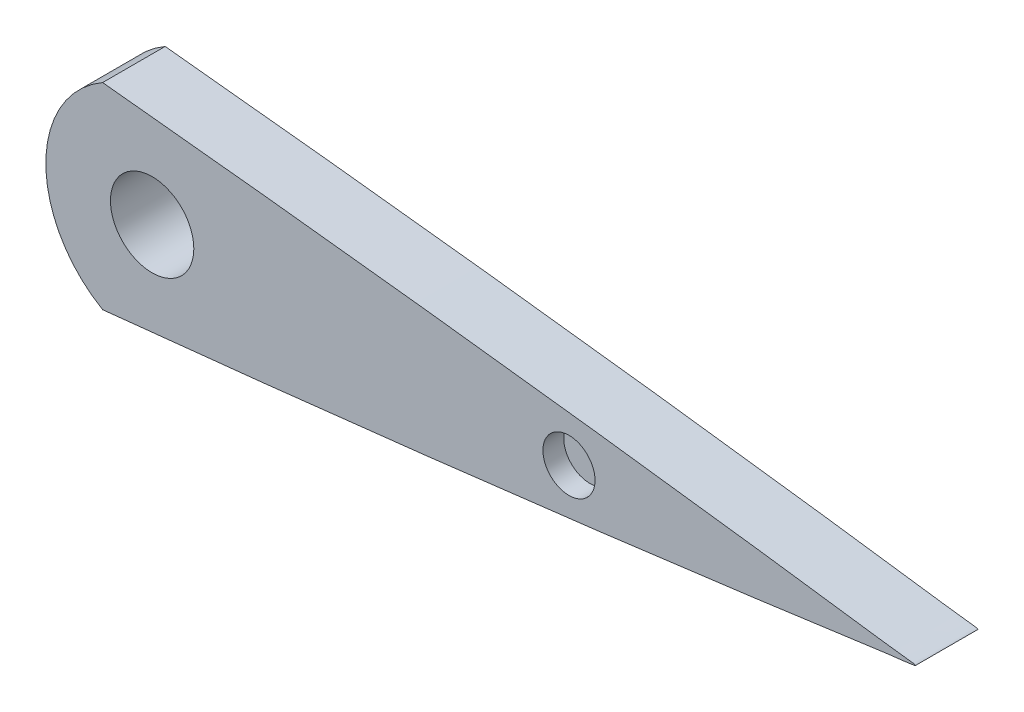
ISO-10303-21;
HEADER;
FILE_DESCRIPTION(('STEP AP214'),'2;1');
FILE_NAME('part.step','',(''),(''),'','','');
FILE_SCHEMA(('AUTOMOTIVE_DESIGN { 1 0 10303 214 1 1 1 1 }'));
ENDSEC;
DATA;
#1=APPLICATION_CONTEXT('core data for automotive mechanical design processes');
#2=APPLICATION_PROTOCOL_DEFINITION('international standard','automotive_design',2000,#1);
#3=PRODUCT_CONTEXT('',#1,'mechanical');
#4=PRODUCT('Part','Part','',(#3));
#5=PRODUCT_RELATED_PRODUCT_CATEGORY('part','',(#4));
#6=PRODUCT_DEFINITION_FORMATION('','',#4);
#7=PRODUCT_DEFINITION_CONTEXT('part definition',#1,'design');
#8=PRODUCT_DEFINITION('design','',#6,#7);
#9=PRODUCT_DEFINITION_SHAPE('','',#8);
#10=(LENGTH_UNIT() NAMED_UNIT(*) SI_UNIT(.MILLI.,.METRE.));
#11=(NAMED_UNIT(*) PLANE_ANGLE_UNIT() SI_UNIT($,.RADIAN.));
#12=(NAMED_UNIT(*) SI_UNIT($,.STERADIAN.) SOLID_ANGLE_UNIT());
#13=UNCERTAINTY_MEASURE_WITH_UNIT(LENGTH_MEASURE(1.E-05),#10,'distance_accuracy_value','');
#14=(GEOMETRIC_REPRESENTATION_CONTEXT(3) GLOBAL_UNCERTAINTY_ASSIGNED_CONTEXT((#13)) GLOBAL_UNIT_ASSIGNED_CONTEXT((#10,
#11,#12)) REPRESENTATION_CONTEXT('',''));
#15=CARTESIAN_POINT('',(0.,0.,0.));
#16=DIRECTION('',(0.,0.,1.));
#17=DIRECTION('',(1.,0.,0.));
#18=AXIS2_PLACEMENT_3D('',#15,#16,#17);
#19=CARTESIAN_POINT('',(215.04981094645,0.,6.));
#20=DIRECTION('',(0.,0.,-1.));
#21=DIRECTION('',(-1.,0.,0.));
#22=AXIS2_PLACEMENT_3D('',#19,#20,#21);
#23=CYLINDRICAL_SURFACE('',#22,10.8996218929007);
#24=CARTESIAN_POINT('',(215.04981094645,0.,0.));
#25=DIRECTION('',(0.,0.,1.));
#26=DIRECTION('',(1.,0.,0.));
#27=AXIS2_PLACEMENT_3D('',#24,#25,#26);
#28=CIRCLE('',#27,10.8996218929007);
#29=CARTESIAN_POINT('',(209.6,9.43934945089707,0.));
#30=VERTEX_POINT('',#29);
#31=CARTESIAN_POINT('',(209.6,-9.43934945089705,0.));
#32=VERTEX_POINT('',#31);
#33=EDGE_CURVE('E67',#30,#32,#28,.T.);
#34=ORIENTED_EDGE('',*,*,#33,.T.);
#35=DIRECTION('',(0.,0.,-1.));
#36=VECTOR('',#35,1.);
#37=CARTESIAN_POINT('',(209.6,-9.43934945089705,6.));
#38=LINE('',#37,#36);
#39=CARTESIAN_POINT('',(209.6,-9.43934945089705,6.));
#40=VERTEX_POINT('',#39);
#41=EDGE_CURVE('E11',#40,#32,#38,.T.);
#42=ORIENTED_EDGE('',*,*,#41,.F.);
#43=CARTESIAN_POINT('',(215.04981094645,0.,6.));
#44=DIRECTION('',(0.,0.,1.));
#45=DIRECTION('',(1.,0.,0.));
#46=AXIS2_PLACEMENT_3D('',#43,#44,#45);
#47=CIRCLE('',#46,10.8996218929007);
#48=CARTESIAN_POINT('',(209.6,9.43934945089707,6.));
#49=VERTEX_POINT('',#48);
#50=EDGE_CURVE('E70',#49,#40,#47,.T.);
#51=ORIENTED_EDGE('',*,*,#50,.F.);
#52=DIRECTION('',(0.,0.,-1.));
#53=VECTOR('',#52,1.);
#54=CARTESIAN_POINT('',(209.6,9.43934945089707,6.));
#55=LINE('',#54,#53);
#56=EDGE_CURVE('E44',#49,#30,#55,.T.);
#57=ORIENTED_EDGE('',*,*,#56,.T.);
#58=EDGE_LOOP('',(#34,#42,#51,#57));
#59=FACE_BOUND('',#58,.T.);
#60=ADVANCED_FACE('F35',(#59),#23,.T.);
#61=CARTESIAN_POINT('',(0.,0.,0.));
#62=DIRECTION('',(0.,0.,1.));
#63=DIRECTION('',(1.,0.,0.));
#64=AXIS2_PLACEMENT_3D('',#61,#62,#63);
#65=PLANE('',#64);
#66=CARTESIAN_POINT('',(214.35,0.,0.));
#67=DIRECTION('',(0.,0.,1.));
#68=DIRECTION('',(1.,0.,0.));
#69=AXIS2_PLACEMENT_3D('',#66,#67,#68);
#70=CIRCLE('',#69,3.99999999999999);
#71=CARTESIAN_POINT('',(218.35,0.,0.));
#72=VERTEX_POINT('',#71);
#73=EDGE_CURVE('E72',#72,#72,#70,.T.);
#74=ORIENTED_EDGE('',*,*,#73,.T.);
#75=EDGE_LOOP('',(#74));
#76=FACE_BOUND('',#75,.T.);
#77=ORIENTED_EDGE('',*,*,#33,.F.);
#78=CARTESIAN_POINT('',(287.6,0.,0.));
#79=CARTESIAN_POINT('',(287.6,0.119697914014841,0.));
#80=CARTESIAN_POINT('',(285.817754552664,0.247185692220203,0.));
#81=CARTESIAN_POINT('',(284.767865992233,0.398094711084379,0.));
#82=CARTESIAN_POINT('',(284.264448894358,0.467820008586102,0.));
#83=CARTESIAN_POINT('',(283.437688129909,0.583773245146681,0.));
#84=CARTESIAN_POINT('',(282.277829484838,0.745074060379501,0.));
#85=CARTESIAN_POINT('',(280.793202235579,0.949881536370258,0.));
#86=CARTESIAN_POINT('',(278.985101469763,1.1984502666094,0.));
#87=CARTESIAN_POINT('',(276.858420544221,1.48809192562316,0.));
#88=CARTESIAN_POINT('',(274.417893216763,1.81693038055174,0.));
#89=CARTESIAN_POINT('',(271.66940199949,2.18355958445684,0.));
#90=CARTESIAN_POINT('',(268.619301695558,2.58534723696543,0.));
#91=CARTESIAN_POINT('',(265.274709703673,3.02040609503913,0.));
#92=CARTESIAN_POINT('',(261.643364864608,3.48524395507677,0.));
#93=CARTESIAN_POINT('',(257.733807870872,3.97868529019274,0.));
#94=CARTESIAN_POINT('',(253.555140370569,4.49727783038827,0.));
#95=CARTESIAN_POINT('',(249.117159968939,5.03833936487388,0.));
#96=CARTESIAN_POINT('',(244.430264247496,5.59945473584973,0.));
#97=CARTESIAN_POINT('',(239.505368100464,6.177691952735,0.));
#98=CARTESIAN_POINT('',(234.353792880747,6.76958711877471,0.));
#99=CARTESIAN_POINT('',(228.987863488273,7.37362863835451,0.));
#100=CARTESIAN_POINT('',(223.419943836905,7.98548338443785,0.));
#101=CARTESIAN_POINT('',(217.663214550996,8.6035080668215,0.));
#102=CARTESIAN_POINT('',(211.730895239435,9.2232861411125,0.));
#103=CARTESIAN_POINT('',(205.636969584255,9.84366910331874,0.));
#104=CARTESIAN_POINT('',(199.395595320274,10.45987310798,0.));
#105=CARTESIAN_POINT('',(193.021447659429,11.069962817779,0.));
#106=CARTESIAN_POINT('',(186.529328524621,11.6697008746456,0.));
#107=CARTESIAN_POINT('',(179.934382420697,12.2571265394771,0.));
#108=CARTESIAN_POINT('',(173.252052511447,12.8273836050006,0.));
#109=CARTESIAN_POINT('',(166.497911298237,13.3779214288825,0.));
#110=CARTESIAN_POINT('',(159.687818768774,13.9052241538978,0.));
#111=CARTESIAN_POINT('',(152.837593287382,14.4050588321949,0.));
#112=CARTESIAN_POINT('',(145.963333172088,14.8742906122945,0.));
#113=CARTESIAN_POINT('',(139.081085421989,15.3091712857545,0.));
#114=CARTESIAN_POINT('',(132.206780290406,15.7055009599027,0.));
#115=CARTESIAN_POINT('',(125.356600440192,16.0601454359753,0.));
#116=CARTESIAN_POINT('',(118.546388357296,16.3692329997914,0.));
#117=CARTESIAN_POINT('',(111.792105264837,16.629320446272,0.));
#118=CARTESIAN_POINT('',(105.109627009694,16.837520337437,0.));
#119=CARTESIAN_POINT('',(98.514511854997,16.9901292177328,0.));
#120=CARTESIAN_POINT('',(92.0221565970091,17.0844567684101,0.));
#121=CARTESIAN_POINT('',(85.6475664190688,17.1178517461476,0.));
#122=CARTESIAN_POINT('',(79.4057544711064,17.0883297738282,0.));
#123=CARTESIAN_POINT('',(73.3113289392046,16.9945635357831,0.));
#124=CARTESIAN_POINT('',(67.3785710157447,16.8337193151445,0.));
#125=CARTESIAN_POINT('',(61.6212046695942,16.6065088817885,0.));
#126=CARTESIAN_POINT('',(56.0526639568473,16.3112996890211,0.));
#127=CARTESIAN_POINT('',(50.6859131508304,15.9489191467969,0.));
#128=CARTESIAN_POINT('',(45.5335897343173,15.5194428091914,0.));
#129=CARTESIAN_POINT('',(40.607672549961,15.0236512800114,0.));
#130=CARTESIAN_POINT('',(35.9196071306174,14.4634253189774,0.));
#131=CARTESIAN_POINT('',(31.4802012991654,13.8410420830018,0.));
#132=CARTESIAN_POINT('',(27.2999132394191,13.1576617434693,0.));
#133=CARTESIAN_POINT('',(23.3883233748371,12.4166997464567,0.));
#134=CARTESIAN_POINT('',(19.7544341778053,11.6209421860295,0.));
#135=CARTESIAN_POINT('',(16.4067383300376,10.7730866418769,0.));
#136=CARTESIAN_POINT('',(13.3526332085872,9.87693133405896,0.));
#137=CARTESIAN_POINT('',(10.5988531034695,8.93545239752696,0.));
#138=CARTESIAN_POINT('',(8.15127060236487,7.95190150330027,0.));
#139=CARTESIAN_POINT('',(6.01473080478667,6.92911600148182,0.));
#140=CARTESIAN_POINT('',(4.1933041001361,5.86922528338378,0.));
#141=CARTESIAN_POINT('',(2.68911146322606,4.77402607186209,0.));
#142=CARTESIAN_POINT('',(1.5050594014883,3.64171682748772,0.));
#143=CARTESIAN_POINT('',(0.644003291289437,2.46908990410035,0.));
#144=CARTESIAN_POINT('',(0.117552225010534,1.25041364148594,0.));
#145=CARTESIAN_POINT('',(-0.0572998766529997,0.,0.));
#146=CARTESIAN_POINT('',(0.117552225010506,-1.25041364148582,0.));
#147=CARTESIAN_POINT('',(0.644003291289472,-2.46908990410043,0.));
#148=CARTESIAN_POINT('',(1.50505940148827,-3.64171682748767,0.));
#149=CARTESIAN_POINT('',(2.68911146322611,-4.77402607186214,0.));
#150=CARTESIAN_POINT('',(4.19330410013606,-5.86922528338374,0.));
#151=CARTESIAN_POINT('',(6.01473080478668,-6.92911600148183,0.));
#152=CARTESIAN_POINT('',(8.15127060236485,-7.95190150330026,0.));
#153=CARTESIAN_POINT('',(10.5988531034695,-8.93545239752697,0.));
#154=CARTESIAN_POINT('',(13.3526332085872,-9.87693133405896,0.));
#155=CARTESIAN_POINT('',(16.4067383300376,-10.7730866418769,0.));
#156=CARTESIAN_POINT('',(19.7544341778053,-11.6209421860295,0.));
#157=CARTESIAN_POINT('',(23.3883233748371,-12.4166997464567,0.));
#158=CARTESIAN_POINT('',(27.2999132394191,-13.1576617434693,0.));
#159=CARTESIAN_POINT('',(31.4802012991654,-13.8410420830018,0.));
#160=CARTESIAN_POINT('',(35.9196071306174,-14.4634253189774,0.));
#161=CARTESIAN_POINT('',(40.607672549961,-15.0236512800114,0.));
#162=CARTESIAN_POINT('',(45.5335897343173,-15.5194428091914,0.));
#163=CARTESIAN_POINT('',(50.6859131508304,-15.9489191467969,0.));
#164=CARTESIAN_POINT('',(56.0526639568472,-16.3112996890211,0.));
#165=CARTESIAN_POINT('',(61.6212046695943,-16.6065088817886,0.));
#166=CARTESIAN_POINT('',(67.3785710157446,-16.8337193151445,0.));
#167=CARTESIAN_POINT('',(73.3113289392046,-16.9945635357831,0.));
#168=CARTESIAN_POINT('',(79.4057544711064,-17.0883297738282,0.));
#169=CARTESIAN_POINT('',(85.6475664190687,-17.1178517461476,0.));
#170=CARTESIAN_POINT('',(92.0221565970092,-17.0844567684101,0.));
#171=CARTESIAN_POINT('',(98.5145118549969,-16.9901292177328,0.));
#172=CARTESIAN_POINT('',(105.109627009694,-16.837520337437,0.));
#173=CARTESIAN_POINT('',(111.792105264837,-16.629320446272,0.));
#174=CARTESIAN_POINT('',(118.546388357296,-16.3692329997914,0.));
#175=CARTESIAN_POINT('',(125.356600440192,-16.0601454359753,0.));
#176=CARTESIAN_POINT('',(132.206780290406,-15.7055009599027,0.));
#177=CARTESIAN_POINT('',(139.081085421989,-15.3091712857545,0.));
#178=CARTESIAN_POINT('',(145.963333172087,-14.8742906122945,0.));
#179=CARTESIAN_POINT('',(152.837593287382,-14.4050588321949,0.));
#180=CARTESIAN_POINT('',(159.687818768774,-13.9052241538978,0.));
#181=CARTESIAN_POINT('',(166.497911298237,-13.3779214288825,0.));
#182=CARTESIAN_POINT('',(173.252052511447,-12.8273836050006,0.));
#183=CARTESIAN_POINT('',(179.934382420697,-12.2571265394771,0.));
#184=CARTESIAN_POINT('',(186.529328524621,-11.6697008746456,0.));
#185=CARTESIAN_POINT('',(193.021447659429,-11.069962817779,0.));
#186=CARTESIAN_POINT('',(199.395595320274,-10.4598731079799,0.));
#187=CARTESIAN_POINT('',(205.636969584255,-9.84366910331874,0.));
#188=CARTESIAN_POINT('',(211.730895239435,-9.2232861411125,0.));
#189=CARTESIAN_POINT('',(217.663214550996,-8.6035080668215,0.));
#190=CARTESIAN_POINT('',(223.419943836904,-7.98548338443785,0.));
#191=CARTESIAN_POINT('',(228.987863488273,-7.37362863835451,0.));
#192=CARTESIAN_POINT('',(234.353792880747,-6.76958711877471,0.));
#193=CARTESIAN_POINT('',(239.505368100465,-6.177691952735,0.));
#194=CARTESIAN_POINT('',(244.430264247496,-5.59945473584973,0.));
#195=CARTESIAN_POINT('',(249.117159968939,-5.03833936487388,0.));
#196=CARTESIAN_POINT('',(253.555140370569,-4.49727783038826,0.));
#197=CARTESIAN_POINT('',(257.733807870872,-3.97868529019274,0.));
#198=CARTESIAN_POINT('',(261.643364864608,-3.48524395507677,0.));
#199=CARTESIAN_POINT('',(265.274709703674,-3.02040609503912,0.));
#200=CARTESIAN_POINT('',(268.619301695558,-2.58534723696544,0.));
#201=CARTESIAN_POINT('',(271.66940199949,-2.18355958445684,0.));
#202=CARTESIAN_POINT('',(274.417893216763,-1.81693038055173,0.));
#203=CARTESIAN_POINT('',(276.858420544221,-1.48809192562316,0.));
#204=CARTESIAN_POINT('',(278.985101469763,-1.19845026660941,0.));
#205=CARTESIAN_POINT('',(280.793202235579,-0.949881536370248,0.));
#206=CARTESIAN_POINT('',(282.277829484838,-0.745074060379503,0.));
#207=CARTESIAN_POINT('',(283.437688129909,-0.583773245146693,0.));
#208=CARTESIAN_POINT('',(284.264448894358,-0.467820008586088,0.));
#209=CARTESIAN_POINT('',(284.767865992233,-0.398094711084389,0.));
#210=CARTESIAN_POINT('',(285.817754552664,-0.24718569222016,0.));
#211=CARTESIAN_POINT('',(287.6,-0.119697914014841,0.));
#212=CARTESIAN_POINT('',(287.6,0.,0.));
#213=B_SPLINE_CURVE_WITH_KNOTS('',3,(#78,#79,#80,#81,#82,#83,#84,#85,#86,#87,#88,#89,#90,#91,
#92,#93,#94,#95,#96,#97,#98,#99,#100,#101,#102,#103,#104,#105,#106,#107,#108,#109,#110,#111,
#112,#113,#114,#115,#116,#117,#118,#119,#120,#121,#122,#123,#124,#125,#126,#127,#128,#129,#130,
#131,#132,#133,#134,#135,#136,#137,#138,#139,#140,#141,#142,#143,#144,#145,#146,#147,#148,#149,
#150,#151,#152,#153,#154,#155,#156,#157,#158,#159,#160,#161,#162,#163,#164,#165,#166,#167,#168,
#169,#170,#171,#172,#173,#174,#175,#176,#177,#178,#179,#180,#181,#182,#183,#184,#185,#186,#187,
#188,#189,#190,#191,#192,#193,#194,#195,#196,#197,#198,#199,#200,#201,#202,#203,#204,#205,#206,
#207,#208,#209,#210,#211,#212),.UNSPECIFIED.,.T.,.F.,(4,1,1,1,1,1,1,1,1,1,1,1,1,1,1,1,1,1,1,1,1,
1,1,1,1,1,1,1,1,1,1,1,1,1,1,1,1,1,1,1,1,1,1,1,1,1,1,1,1,1,1,1,1,1,1,1,1,1,1,1,1,1,1,1,1,1,1,1,1,
1,1,1,1,1,1,1,1,1,1,1,1,1,1,1,1,1,1,1,1,1,1,1,1,1,1,1,1,1,1,1,1,1,1,1,1,1,1,1,1,1,1,1,1,1,1,1,1,
1,1,1,1,1,1,1,1,1,1,1,1,1,1,1,4),(0.,0.00440467874114974,0.00469133243498179,
0.00555026343079178,0.00697995997176306,0.00897636965828355,0.0115348259845733,
0.014649420054061,0.0183124680898201,0.0225153298008114,0.0272475070546298,0.0324978969838546,
0.0382539577522555,0.044502067222391,0.0512268693575091,0.0584133135935181,0.0660434674273018,
0.0740989842283932,0.0825619521117382,0.0914115186604247,0.100627009072821,0.110186574614935,
0.120067574865949,0.130246743077792,0.140700546583312,0.151404252252594,0.162331841984017,
0.173458675416978,0.184758289770567,0.19620407601809,0.207768617658098,0.21942594490095,
0.231147635091939,0.242906359386442,0.25467529642669,0.266426209726725,0.278132454883059,
0.289766476692586,0.301301813989679,0.312711645869573,0.323969258957322,0.335050049679421,
0.345928598530739,0.356580621255151,0.366981996115004,0.377109775977847,0.386942118770167,
0.396457905020584,0.405636644874136,0.414459070105715,0.422906620431116,0.430962851267296,
0.438611617871312,0.445838274987848,0.45263037682836,0.458976172588996,0.464866300146168,
0.470293867967317,0.475254828838946,0.479749124231831,0.483781005915864,0.487362579764443,
0.490515631725796,0.493278565847941,0.495712194392614,0.497909944006647,0.5,0.502090055993354,
0.504287805607387,0.50672143415206,0.509484368274205,0.512637420235557,0.516218994084137,
0.52025087576817,0.524745171161054,0.529706132032683,0.535133699853832,0.541023827411005,
0.54736962317164,0.554161725012152,0.561388382128688,0.569037148732705,0.577093379568885,
0.585540929894285,0.594363355125865,0.603542094979417,0.613057881229834,0.622890224022154,
0.633018003884997,0.64341937874485,0.654071401469262,0.66494995032058,0.676030741042678,
0.687288354130427,0.698698186010322,0.710233523307414,0.721867545116942,0.733573790273275,
0.74532470357331,0.757093640613558,0.768852364908061,0.780574055099051,0.792231382341903,
0.80379592398191,0.815241710229433,0.826541324583022,0.837668158015983,0.848595747747406,
0.859299453416688,0.869753256922208,0.879932425134051,0.889813425385066,0.89937299092718,
0.908588481339576,0.917438047888262,0.925901015771607,0.933956532572698,0.941586686406482,
0.948773130642491,0.955497932777609,0.961746042247745,0.967502103016146,0.972752492945371,
0.977484670199189,0.98168753191018,0.985350579945939,0.988465174015427,0.991023630341717,
0.993020040028237,0.994449736569208,0.995308667565018,0.99559532125885,1.),.UNSPECIFIED.);
#214=EDGE_CURVE('E59',#32,#30,#213,.T.);
#215=ORIENTED_EDGE('',*,*,#214,.F.);
#216=EDGE_LOOP('',(#77,#215));
#217=FACE_BOUND('',#216,.T.);
#218=ADVANCED_FACE('F71',(#76,#217),#65,.F.);
#219=CARTESIAN_POINT('',(287.6,0.,6.));
#220=CARTESIAN_POINT('',(287.6,0.119697914014841,6.));
#221=CARTESIAN_POINT('',(285.817754552664,0.247185692220203,6.));
#222=CARTESIAN_POINT('',(284.767865992233,0.398094711084379,6.));
#223=CARTESIAN_POINT('',(284.264448894358,0.467820008586102,6.));
#224=CARTESIAN_POINT('',(283.437688129909,0.583773245146681,6.));
#225=CARTESIAN_POINT('',(282.277829484838,0.745074060379501,6.));
#226=CARTESIAN_POINT('',(280.793202235579,0.949881536370258,6.));
#227=CARTESIAN_POINT('',(278.985101469763,1.1984502666094,6.));
#228=CARTESIAN_POINT('',(276.858420544221,1.48809192562316,6.));
#229=CARTESIAN_POINT('',(274.417893216763,1.81693038055174,6.));
#230=CARTESIAN_POINT('',(271.66940199949,2.18355958445684,6.));
#231=CARTESIAN_POINT('',(268.619301695558,2.58534723696543,6.));
#232=CARTESIAN_POINT('',(265.274709703673,3.02040609503913,6.));
#233=CARTESIAN_POINT('',(261.643364864608,3.48524395507677,6.));
#234=CARTESIAN_POINT('',(257.733807870872,3.97868529019274,6.));
#235=CARTESIAN_POINT('',(253.555140370569,4.49727783038827,6.));
#236=CARTESIAN_POINT('',(249.117159968939,5.03833936487388,6.));
#237=CARTESIAN_POINT('',(244.430264247496,5.59945473584973,6.));
#238=CARTESIAN_POINT('',(239.505368100464,6.177691952735,6.));
#239=CARTESIAN_POINT('',(234.353792880747,6.76958711877471,6.));
#240=CARTESIAN_POINT('',(228.987863488273,7.37362863835451,6.));
#241=CARTESIAN_POINT('',(223.419943836905,7.98548338443785,6.));
#242=CARTESIAN_POINT('',(217.663214550996,8.6035080668215,6.));
#243=CARTESIAN_POINT('',(211.730895239435,9.2232861411125,6.));
#244=CARTESIAN_POINT('',(205.636969584255,9.84366910331874,6.));
#245=CARTESIAN_POINT('',(199.395595320274,10.45987310798,6.));
#246=CARTESIAN_POINT('',(193.021447659429,11.069962817779,6.));
#247=CARTESIAN_POINT('',(186.529328524621,11.6697008746456,6.));
#248=CARTESIAN_POINT('',(179.934382420697,12.2571265394771,6.));
#249=CARTESIAN_POINT('',(173.252052511447,12.8273836050006,6.));
#250=CARTESIAN_POINT('',(166.497911298237,13.3779214288825,6.));
#251=CARTESIAN_POINT('',(159.687818768774,13.9052241538978,6.));
#252=CARTESIAN_POINT('',(152.837593287382,14.4050588321949,6.));
#253=CARTESIAN_POINT('',(145.963333172088,14.8742906122945,6.));
#254=CARTESIAN_POINT('',(139.081085421989,15.3091712857545,6.));
#255=CARTESIAN_POINT('',(132.206780290406,15.7055009599027,6.));
#256=CARTESIAN_POINT('',(125.356600440192,16.0601454359753,6.));
#257=CARTESIAN_POINT('',(118.546388357296,16.3692329997914,6.));
#258=CARTESIAN_POINT('',(111.792105264837,16.629320446272,6.));
#259=CARTESIAN_POINT('',(105.109627009694,16.837520337437,6.));
#260=CARTESIAN_POINT('',(98.514511854997,16.9901292177328,6.));
#261=CARTESIAN_POINT('',(92.0221565970091,17.0844567684101,6.));
#262=CARTESIAN_POINT('',(85.6475664190688,17.1178517461476,6.));
#263=CARTESIAN_POINT('',(79.4057544711064,17.0883297738282,6.));
#264=CARTESIAN_POINT('',(73.3113289392046,16.9945635357831,6.));
#265=CARTESIAN_POINT('',(67.3785710157447,16.8337193151445,6.));
#266=CARTESIAN_POINT('',(61.6212046695942,16.6065088817885,6.));
#267=CARTESIAN_POINT('',(56.0526639568473,16.3112996890211,6.));
#268=CARTESIAN_POINT('',(50.6859131508304,15.9489191467969,6.));
#269=CARTESIAN_POINT('',(45.5335897343173,15.5194428091914,6.));
#270=CARTESIAN_POINT('',(40.607672549961,15.0236512800114,6.));
#271=CARTESIAN_POINT('',(35.9196071306174,14.4634253189774,6.));
#272=CARTESIAN_POINT('',(31.4802012991654,13.8410420830018,6.));
#273=CARTESIAN_POINT('',(27.2999132394191,13.1576617434693,6.));
#274=CARTESIAN_POINT('',(23.3883233748371,12.4166997464567,6.));
#275=CARTESIAN_POINT('',(19.7544341778053,11.6209421860295,6.));
#276=CARTESIAN_POINT('',(16.4067383300376,10.7730866418769,6.));
#277=CARTESIAN_POINT('',(13.3526332085872,9.87693133405896,6.));
#278=CARTESIAN_POINT('',(10.5988531034695,8.93545239752696,6.));
#279=CARTESIAN_POINT('',(8.15127060236487,7.95190150330027,6.));
#280=CARTESIAN_POINT('',(6.01473080478667,6.92911600148182,6.));
#281=CARTESIAN_POINT('',(4.1933041001361,5.86922528338378,6.));
#282=CARTESIAN_POINT('',(2.68911146322606,4.77402607186209,6.));
#283=CARTESIAN_POINT('',(1.5050594014883,3.64171682748772,6.));
#284=CARTESIAN_POINT('',(0.644003291289437,2.46908990410035,6.));
#285=CARTESIAN_POINT('',(0.117552225010534,1.25041364148594,6.));
#286=CARTESIAN_POINT('',(-0.0572998766529997,0.,6.));
#287=CARTESIAN_POINT('',(0.117552225010506,-1.25041364148582,6.));
#288=CARTESIAN_POINT('',(0.644003291289472,-2.46908990410043,6.));
#289=CARTESIAN_POINT('',(1.50505940148827,-3.64171682748767,6.));
#290=CARTESIAN_POINT('',(2.68911146322611,-4.77402607186214,6.));
#291=CARTESIAN_POINT('',(4.19330410013606,-5.86922528338374,6.));
#292=CARTESIAN_POINT('',(6.01473080478668,-6.92911600148183,6.));
#293=CARTESIAN_POINT('',(8.15127060236485,-7.95190150330026,6.));
#294=CARTESIAN_POINT('',(10.5988531034695,-8.93545239752697,6.));
#295=CARTESIAN_POINT('',(13.3526332085872,-9.87693133405896,6.));
#296=CARTESIAN_POINT('',(16.4067383300376,-10.7730866418769,6.));
#297=CARTESIAN_POINT('',(19.7544341778053,-11.6209421860295,6.));
#298=CARTESIAN_POINT('',(23.3883233748371,-12.4166997464567,6.));
#299=CARTESIAN_POINT('',(27.2999132394191,-13.1576617434693,6.));
#300=CARTESIAN_POINT('',(31.4802012991654,-13.8410420830018,6.));
#301=CARTESIAN_POINT('',(35.9196071306174,-14.4634253189774,6.));
#302=CARTESIAN_POINT('',(40.607672549961,-15.0236512800114,6.));
#303=CARTESIAN_POINT('',(45.5335897343173,-15.5194428091914,6.));
#304=CARTESIAN_POINT('',(50.6859131508304,-15.9489191467969,6.));
#305=CARTESIAN_POINT('',(56.0526639568472,-16.3112996890211,6.));
#306=CARTESIAN_POINT('',(61.6212046695943,-16.6065088817886,6.));
#307=CARTESIAN_POINT('',(67.3785710157446,-16.8337193151445,6.));
#308=CARTESIAN_POINT('',(73.3113289392046,-16.9945635357831,6.));
#309=CARTESIAN_POINT('',(79.4057544711064,-17.0883297738282,6.));
#310=CARTESIAN_POINT('',(85.6475664190687,-17.1178517461476,6.));
#311=CARTESIAN_POINT('',(92.0221565970092,-17.0844567684101,6.));
#312=CARTESIAN_POINT('',(98.5145118549969,-16.9901292177328,6.));
#313=CARTESIAN_POINT('',(105.109627009694,-16.837520337437,6.));
#314=CARTESIAN_POINT('',(111.792105264837,-16.629320446272,6.));
#315=CARTESIAN_POINT('',(118.546388357296,-16.3692329997914,6.));
#316=CARTESIAN_POINT('',(125.356600440192,-16.0601454359753,6.));
#317=CARTESIAN_POINT('',(132.206780290406,-15.7055009599027,6.));
#318=CARTESIAN_POINT('',(139.081085421989,-15.3091712857545,6.));
#319=CARTESIAN_POINT('',(145.963333172087,-14.8742906122945,6.));
#320=CARTESIAN_POINT('',(152.837593287382,-14.4050588321949,6.));
#321=CARTESIAN_POINT('',(159.687818768774,-13.9052241538978,6.));
#322=CARTESIAN_POINT('',(166.497911298237,-13.3779214288825,6.));
#323=CARTESIAN_POINT('',(173.252052511447,-12.8273836050006,6.));
#324=CARTESIAN_POINT('',(179.934382420697,-12.2571265394771,6.));
#325=CARTESIAN_POINT('',(186.529328524621,-11.6697008746456,6.));
#326=CARTESIAN_POINT('',(193.021447659429,-11.069962817779,6.));
#327=CARTESIAN_POINT('',(199.395595320274,-10.4598731079799,6.));
#328=CARTESIAN_POINT('',(205.636969584255,-9.84366910331874,6.));
#329=CARTESIAN_POINT('',(211.730895239435,-9.2232861411125,6.));
#330=CARTESIAN_POINT('',(217.663214550996,-8.6035080668215,6.));
#331=CARTESIAN_POINT('',(223.419943836904,-7.98548338443785,6.));
#332=CARTESIAN_POINT('',(228.987863488273,-7.37362863835451,6.));
#333=CARTESIAN_POINT('',(234.353792880747,-6.76958711877471,6.));
#334=CARTESIAN_POINT('',(239.505368100465,-6.177691952735,6.));
#335=CARTESIAN_POINT('',(244.430264247496,-5.59945473584973,6.));
#336=CARTESIAN_POINT('',(249.117159968939,-5.03833936487388,6.));
#337=CARTESIAN_POINT('',(253.555140370569,-4.49727783038826,6.));
#338=CARTESIAN_POINT('',(257.733807870872,-3.97868529019274,6.));
#339=CARTESIAN_POINT('',(261.643364864608,-3.48524395507677,6.));
#340=CARTESIAN_POINT('',(265.274709703674,-3.02040609503912,6.));
#341=CARTESIAN_POINT('',(268.619301695558,-2.58534723696544,6.));
#342=CARTESIAN_POINT('',(271.66940199949,-2.18355958445684,6.));
#343=CARTESIAN_POINT('',(274.417893216763,-1.81693038055173,6.));
#344=CARTESIAN_POINT('',(276.858420544221,-1.48809192562316,6.));
#345=CARTESIAN_POINT('',(278.985101469763,-1.19845026660941,6.));
#346=CARTESIAN_POINT('',(280.793202235579,-0.949881536370248,6.));
#347=CARTESIAN_POINT('',(282.277829484838,-0.745074060379503,6.));
#348=CARTESIAN_POINT('',(283.437688129909,-0.583773245146693,6.));
#349=CARTESIAN_POINT('',(284.264448894358,-0.467820008586088,6.));
#350=CARTESIAN_POINT('',(284.767865992233,-0.398094711084389,6.));
#351=CARTESIAN_POINT('',(285.817754552664,-0.24718569222016,6.));
#352=CARTESIAN_POINT('',(287.6,-0.119697914014841,6.));
#353=CARTESIAN_POINT('',(287.6,0.,6.));
#354=B_SPLINE_CURVE_WITH_KNOTS('',3,(#219,#220,#221,#222,#223,#224,#225,#226,#227,#228,#229,
#230,#231,#232,#233,#234,#235,#236,#237,#238,#239,#240,#241,#242,#243,#244,#245,#246,#247,#248,
#249,#250,#251,#252,#253,#254,#255,#256,#257,#258,#259,#260,#261,#262,#263,#264,#265,#266,#267,
#268,#269,#270,#271,#272,#273,#274,#275,#276,#277,#278,#279,#280,#281,#282,#283,#284,#285,#286,
#287,#288,#289,#290,#291,#292,#293,#294,#295,#296,#297,#298,#299,#300,#301,#302,#303,#304,#305,
#306,#307,#308,#309,#310,#311,#312,#313,#314,#315,#316,#317,#318,#319,#320,#321,#322,#323,#324,
#325,#326,#327,#328,#329,#330,#331,#332,#333,#334,#335,#336,#337,#338,#339,#340,#341,#342,#343,
#344,#345,#346,#347,#348,#349,#350,#351,#352,#353),.UNSPECIFIED.,.T.,.F.,(4,1,1,1,1,1,1,1,1,1,1,
1,1,1,1,1,1,1,1,1,1,1,1,1,1,1,1,1,1,1,1,1,1,1,1,1,1,1,1,1,1,1,1,1,1,1,1,1,1,1,1,1,1,1,1,1,1,1,1,
1,1,1,1,1,1,1,1,1,1,1,1,1,1,1,1,1,1,1,1,1,1,1,1,1,1,1,1,1,1,1,1,1,1,1,1,1,1,1,1,1,1,1,1,1,1,1,1,
1,1,1,1,1,1,1,1,1,1,1,1,1,1,1,1,1,1,1,1,1,1,1,1,1,4),(0.,0.00440467874114974,
0.00469133243498179,0.00555026343079178,0.00697995997176306,0.00897636965828355,
0.0115348259845733,0.014649420054061,0.0183124680898201,0.0225153298008114,0.0272475070546298,
0.0324978969838546,0.0382539577522555,0.044502067222391,0.0512268693575091,0.0584133135935181,
0.0660434674273018,0.0740989842283932,0.0825619521117382,0.0914115186604247,0.100627009072821,
0.110186574614935,0.120067574865949,0.130246743077792,0.140700546583312,0.151404252252594,
0.162331841984017,0.173458675416978,0.184758289770567,0.19620407601809,0.207768617658098,
0.21942594490095,0.231147635091939,0.242906359386442,0.25467529642669,0.266426209726725,
0.278132454883059,0.289766476692586,0.301301813989679,0.312711645869573,0.323969258957322,
0.335050049679421,0.345928598530739,0.356580621255151,0.366981996115004,0.377109775977847,
0.386942118770167,0.396457905020584,0.405636644874136,0.414459070105715,0.422906620431116,
0.430962851267296,0.438611617871312,0.445838274987848,0.45263037682836,0.458976172588996,
0.464866300146168,0.470293867967317,0.475254828838946,0.479749124231831,0.483781005915864,
0.487362579764443,0.490515631725796,0.493278565847941,0.495712194392614,0.497909944006647,0.5,
0.502090055993354,0.504287805607387,0.50672143415206,0.509484368274205,0.512637420235557,
0.516218994084137,0.52025087576817,0.524745171161054,0.529706132032683,0.535133699853832,
0.541023827411005,0.54736962317164,0.554161725012152,0.561388382128688,0.569037148732705,
0.577093379568885,0.585540929894285,0.594363355125865,0.603542094979417,0.613057881229834,
0.622890224022154,0.633018003884997,0.64341937874485,0.654071401469262,0.66494995032058,
0.676030741042678,0.687288354130427,0.698698186010322,0.710233523307414,0.721867545116942,
0.733573790273275,0.74532470357331,0.757093640613558,0.768852364908061,0.780574055099051,
0.792231382341903,0.80379592398191,0.815241710229433,0.826541324583022,0.837668158015983,
0.848595747747406,0.859299453416688,0.869753256922208,0.879932425134051,0.889813425385066,
0.89937299092718,0.908588481339576,0.917438047888262,0.925901015771607,0.933956532572698,
0.941586686406482,0.948773130642491,0.955497932777609,0.961746042247745,0.967502103016146,
0.972752492945371,0.977484670199189,0.98168753191018,0.985350579945939,0.988465174015427,
0.991023630341717,0.993020040028237,0.994449736569208,0.995308667565018,0.99559532125885,1.),.UNSPECIFIED.);
#355=DIRECTION('',(0.,0.,-1.));
#356=VECTOR('',#355,1.);
#357=SURFACE_OF_LINEAR_EXTRUSION('',#354,#356);
#358=ORIENTED_EDGE('',*,*,#214,.T.);
#359=ORIENTED_EDGE('',*,*,#56,.F.);
#360=EDGE_CURVE('E51',#40,#49,#354,.T.);
#361=ORIENTED_EDGE('',*,*,#360,.F.);
#362=ORIENTED_EDGE('',*,*,#41,.T.);
#363=EDGE_LOOP('',(#358,#359,#361,#362));
#364=FACE_BOUND('',#363,.T.);
#365=ADVANCED_FACE('F62',(#364),#357,.F.);
#366=CARTESIAN_POINT('',(214.35,0.,6.));
#367=DIRECTION('',(0.,0.,-1.));
#368=DIRECTION('',(-1.,0.,0.));
#369=AXIS2_PLACEMENT_3D('',#366,#367,#368);
#370=CYLINDRICAL_SURFACE('',#369,3.99999999999999);
#371=CARTESIAN_POINT('',(214.35,0.,6.));
#372=DIRECTION('',(0.,0.,1.));
#373=DIRECTION('',(1.,0.,0.));
#374=AXIS2_PLACEMENT_3D('',#371,#372,#373);
#375=CIRCLE('',#374,3.99999999999999);
#376=CARTESIAN_POINT('',(218.35,0.,6.));
#377=VERTEX_POINT('',#376);
#378=EDGE_CURVE('E66',#377,#377,#375,.T.);
#379=ORIENTED_EDGE('',*,*,#378,.T.);
#380=EDGE_LOOP('',(#379));
#381=FACE_BOUND('',#380,.T.);
#382=ORIENTED_EDGE('',*,*,#73,.F.);
#383=EDGE_LOOP('',(#382));
#384=FACE_BOUND('',#383,.T.);
#385=ADVANCED_FACE('F37',(#381,#384),#370,.F.);
#386=CARTESIAN_POINT('',(0.,0.,6.));
#387=DIRECTION('',(0.,0.,1.));
#388=DIRECTION('',(1.,0.,0.));
#389=AXIS2_PLACEMENT_3D('',#386,#387,#388);
#390=PLANE('',#389);
#391=CARTESIAN_POINT('',(254.35,0.,6.));
#392=DIRECTION('',(0.,0.,1.));
#393=DIRECTION('',(1.,0.,0.));
#394=AXIS2_PLACEMENT_3D('',#391,#392,#393);
#395=CIRCLE('',#394,2.50000000000002);
#396=CARTESIAN_POINT('',(256.85,0.,6.));
#397=VERTEX_POINT('',#396);
#398=EDGE_CURVE('E121',#397,#397,#395,.T.);
#399=ORIENTED_EDGE('',*,*,#398,.F.);
#400=EDGE_LOOP('',(#399));
#401=FACE_BOUND('',#400,.T.);
#402=ORIENTED_EDGE('',*,*,#378,.F.);
#403=EDGE_LOOP('',(#402));
#404=FACE_BOUND('',#403,.T.);
#405=ORIENTED_EDGE('',*,*,#50,.T.);
#406=ORIENTED_EDGE('',*,*,#360,.T.);
#407=EDGE_LOOP('',(#405,#406));
#408=FACE_BOUND('',#407,.T.);
#409=ADVANCED_FACE('F96',(#401,#404,#408),#390,.T.);
#410=CARTESIAN_POINT('',(254.35,0.,4.));
#411=DIRECTION('',(0.,0.,1.));
#412=DIRECTION('',(1.,0.,0.));
#413=AXIS2_PLACEMENT_3D('',#410,#411,#412);
#414=CYLINDRICAL_SURFACE('',#413,2.50000000000002);
#415=CARTESIAN_POINT('',(254.35,0.,4.));
#416=DIRECTION('',(0.,0.,1.));
#417=DIRECTION('',(1.,0.,0.));
#418=AXIS2_PLACEMENT_3D('',#415,#416,#417);
#419=CIRCLE('',#418,2.50000000000002);
#420=CARTESIAN_POINT('',(256.85,0.,4.));
#421=VERTEX_POINT('',#420);
#422=EDGE_CURVE('E75',#421,#421,#419,.T.);
#423=ORIENTED_EDGE('',*,*,#422,.F.);
#424=EDGE_LOOP('',(#423));
#425=FACE_BOUND('',#424,.T.);
#426=ORIENTED_EDGE('',*,*,#398,.T.);
#427=EDGE_LOOP('',(#426));
#428=FACE_BOUND('',#427,.T.);
#429=ADVANCED_FACE('F102',(#425,#428),#414,.F.);
#430=CARTESIAN_POINT('',(254.35,0.,4.));
#431=DIRECTION('',(0.,0.,1.));
#432=DIRECTION('',(1.,0.,0.));
#433=AXIS2_PLACEMENT_3D('',#430,#431,#432);
#434=PLANE('',#433);
#435=ORIENTED_EDGE('',*,*,#422,.T.);
#436=EDGE_LOOP('',(#435));
#437=FACE_BOUND('',#436,.T.);
#438=ADVANCED_FACE('F108',(#437),#434,.T.);
#439=CLOSED_SHELL('',(#60,#218,#365,#385,#409,#429,#438));
#440=MANIFOLD_SOLID_BREP('B2',#439);
#441=ADVANCED_BREP_SHAPE_REPRESENTATION('',(#18,#440),#14);
#442=SHAPE_DEFINITION_REPRESENTATION(#9,#441);
ENDSEC;
END-ISO-10303-21;
